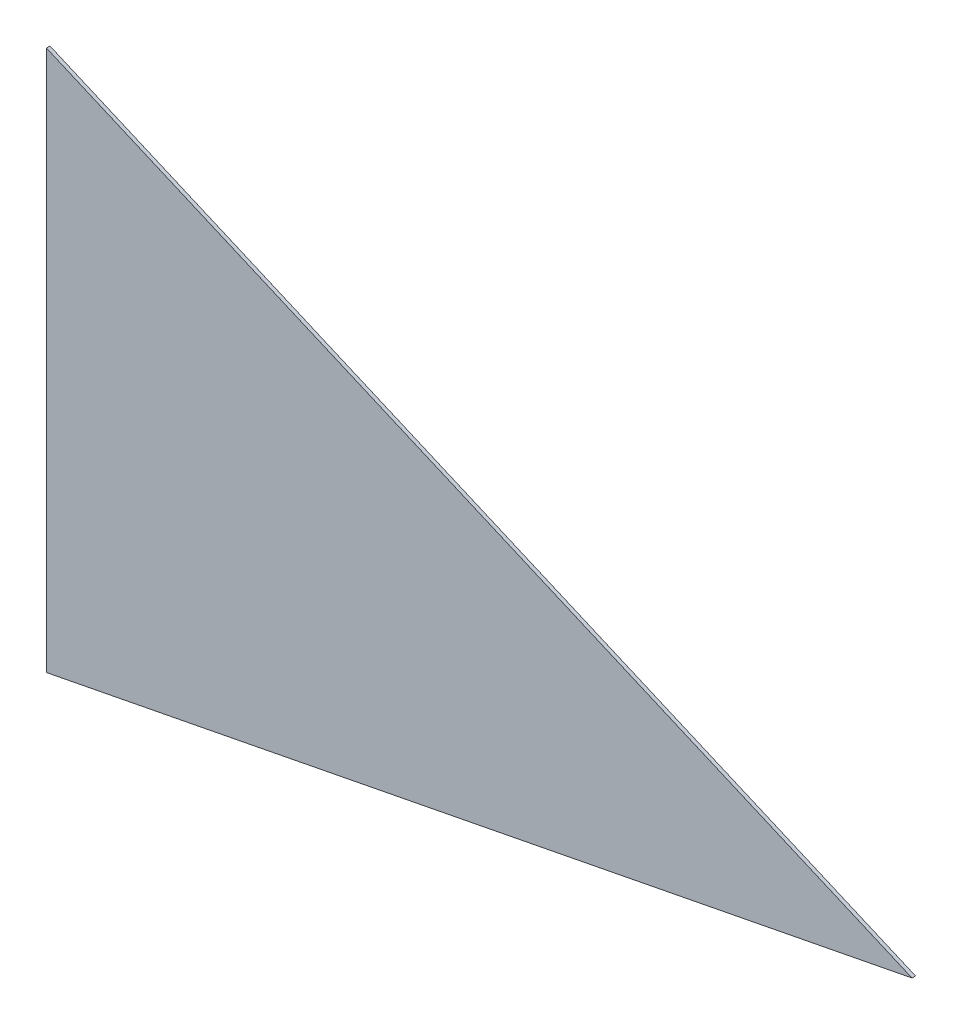
ISO-10303-21;
HEADER;
FILE_DESCRIPTION(('STEP AP214'),'2;1');
FILE_NAME('part.step','',(''),(''),'','','');
FILE_SCHEMA(('AUTOMOTIVE_DESIGN { 1 0 10303 214 1 1 1 1 }'));
ENDSEC;
DATA;
#1=APPLICATION_CONTEXT('core data for automotive mechanical design processes');
#2=APPLICATION_PROTOCOL_DEFINITION('international standard','automotive_design',2000,#1);
#3=PRODUCT_CONTEXT('',#1,'mechanical');
#4=PRODUCT('Part','Part','',(#3));
#5=PRODUCT_RELATED_PRODUCT_CATEGORY('part','',(#4));
#6=PRODUCT_DEFINITION_FORMATION('','',#4);
#7=PRODUCT_DEFINITION_CONTEXT('part definition',#1,'design');
#8=PRODUCT_DEFINITION('design','',#6,#7);
#9=PRODUCT_DEFINITION_SHAPE('','',#8);
#10=(LENGTH_UNIT() NAMED_UNIT(*) SI_UNIT(.MILLI.,.METRE.));
#11=(NAMED_UNIT(*) PLANE_ANGLE_UNIT() SI_UNIT($,.RADIAN.));
#12=(NAMED_UNIT(*) SI_UNIT($,.STERADIAN.) SOLID_ANGLE_UNIT());
#13=UNCERTAINTY_MEASURE_WITH_UNIT(LENGTH_MEASURE(1.E-05),#10,'distance_accuracy_value','');
#14=(GEOMETRIC_REPRESENTATION_CONTEXT(3) GLOBAL_UNCERTAINTY_ASSIGNED_CONTEXT((#13)) GLOBAL_UNIT_ASSIGNED_CONTEXT((#10,
#11,#12)) REPRESENTATION_CONTEXT('',''));
#15=CARTESIAN_POINT('',(0.,0.,0.));
#16=DIRECTION('',(0.,0.,1.));
#17=DIRECTION('',(1.,0.,0.));
#18=AXIS2_PLACEMENT_3D('',#15,#16,#17);
#19=CARTESIAN_POINT('',(0.,0.,3.));
#20=DIRECTION('',(-0.190808995376539,0.981627183447665,0.));
#21=DIRECTION('',(-0.981627183447665,-0.190808995376539,0.));
#22=AXIS2_PLACEMENT_3D('',#19,#20,#21);
#23=PLANE('',#22);
#24=DIRECTION('',(0.981627183447665,0.190808995376539,0.));
#25=VECTOR('',#24,1.);
#26=CARTESIAN_POINT('',(0.,0.,0.));
#27=LINE('',#26,#25);
#28=CARTESIAN_POINT('',(0.,0.,0.));
#29=VERTEX_POINT('',#28);
#30=CARTESIAN_POINT('',(736.220387585749,143.106746532404,0.));
#31=VERTEX_POINT('',#30);
#32=EDGE_CURVE('E80',#29,#31,#27,.T.);
#33=ORIENTED_EDGE('',*,*,#32,.T.);
#34=DIRECTION('',(0.,0.,-1.));
#35=VECTOR('',#34,1.);
#36=CARTESIAN_POINT('',(736.220387585749,143.106746532404,3.));
#37=LINE('',#36,#35);
#38=CARTESIAN_POINT('',(736.220387585749,143.106746532404,3.));
#39=VERTEX_POINT('',#38);
#40=EDGE_CURVE('E11',#39,#31,#37,.T.);
#41=ORIENTED_EDGE('',*,*,#40,.F.);
#42=DIRECTION('',(0.981627183447665,0.190808995376539,0.));
#43=VECTOR('',#42,1.);
#44=CARTESIAN_POINT('',(0.,0.,3.));
#45=LINE('',#44,#43);
#46=CARTESIAN_POINT('',(0.,0.,3.));
#47=VERTEX_POINT('',#46);
#48=EDGE_CURVE('E73',#47,#39,#45,.T.);
#49=ORIENTED_EDGE('',*,*,#48,.F.);
#50=DIRECTION('',(0.,0.,-1.));
#51=VECTOR('',#50,1.);
#52=CARTESIAN_POINT('',(0.,0.,3.));
#53=LINE('',#52,#51);
#54=EDGE_CURVE('E81',#47,#29,#53,.T.);
#55=ORIENTED_EDGE('',*,*,#54,.T.);
#56=EDGE_LOOP('',(#33,#41,#49,#55));
#57=FACE_BOUND('',#56,.T.);
#58=ADVANCED_FACE('F33',(#57),#23,.F.);
#59=CARTESIAN_POINT('',(736.220387585749,143.106746532404,3.));
#60=DIRECTION('',(-0.39536307012628,-0.918524927685864,0.));
#61=DIRECTION('',(0.918524927685864,-0.395363070126281,0.));
#62=AXIS2_PLACEMENT_3D('',#59,#60,#61);
#63=PLANE('',#62);
#64=DIRECTION('',(-0.918524927685864,0.395363070126281,0.));
#65=VECTOR('',#64,1.);
#66=CARTESIAN_POINT('',(736.220387585749,143.106746532404,0.));
#67=LINE('',#66,#65);
#68=CARTESIAN_POINT('',(0.,460.,0.));
#69=VERTEX_POINT('',#68);
#70=EDGE_CURVE('E61',#31,#69,#67,.T.);
#71=ORIENTED_EDGE('',*,*,#70,.T.);
#72=DIRECTION('',(0.,0.,-1.));
#73=VECTOR('',#72,1.);
#74=CARTESIAN_POINT('',(0.,460.,3.));
#75=LINE('',#74,#73);
#76=CARTESIAN_POINT('',(0.,460.,3.));
#77=VERTEX_POINT('',#76);
#78=EDGE_CURVE('E41',#77,#69,#75,.T.);
#79=ORIENTED_EDGE('',*,*,#78,.F.);
#80=DIRECTION('',(-0.918524927685864,0.395363070126281,0.));
#81=VECTOR('',#80,1.);
#82=CARTESIAN_POINT('',(736.220387585749,143.106746532404,3.));
#83=LINE('',#82,#81);
#84=EDGE_CURVE('E69',#39,#77,#83,.T.);
#85=ORIENTED_EDGE('',*,*,#84,.F.);
#86=ORIENTED_EDGE('',*,*,#40,.T.);
#87=EDGE_LOOP('',(#71,#79,#85,#86));
#88=FACE_BOUND('',#87,.T.);
#89=ADVANCED_FACE('F70',(#88),#63,.F.);
#90=CARTESIAN_POINT('',(0.,0.,3.));
#91=DIRECTION('',(1.,0.,0.));
#92=DIRECTION('',(0.,0.,-1.));
#93=AXIS2_PLACEMENT_3D('',#90,#91,#92);
#94=PLANE('',#93);
#95=DIRECTION('',(0.,-1.,0.));
#96=VECTOR('',#95,1.);
#97=CARTESIAN_POINT('',(0.,0.,0.));
#98=LINE('',#97,#96);
#99=EDGE_CURVE('E66',#69,#29,#98,.T.);
#100=ORIENTED_EDGE('',*,*,#99,.T.);
#101=ORIENTED_EDGE('',*,*,#54,.F.);
#102=DIRECTION('',(0.,-1.,0.));
#103=VECTOR('',#102,1.);
#104=CARTESIAN_POINT('',(0.,0.,3.));
#105=LINE('',#104,#103);
#106=EDGE_CURVE('E49',#77,#47,#105,.T.);
#107=ORIENTED_EDGE('',*,*,#106,.F.);
#108=ORIENTED_EDGE('',*,*,#78,.T.);
#109=EDGE_LOOP('',(#100,#101,#107,#108));
#110=FACE_BOUND('',#109,.T.);
#111=ADVANCED_FACE('F88',(#110),#94,.F.);
#112=CARTESIAN_POINT('',(0.,0.,3.));
#113=DIRECTION('',(0.,0.,1.));
#114=DIRECTION('',(1.,0.,0.));
#115=AXIS2_PLACEMENT_3D('',#112,#113,#114);
#116=PLANE('',#115);
#117=ORIENTED_EDGE('',*,*,#48,.T.);
#118=ORIENTED_EDGE('',*,*,#84,.T.);
#119=ORIENTED_EDGE('',*,*,#106,.T.);
#120=EDGE_LOOP('',(#117,#118,#119));
#121=FACE_BOUND('',#120,.T.);
#122=ADVANCED_FACE('F76',(#121),#116,.T.);
#123=CARTESIAN_POINT('',(0.,0.,0.));
#124=DIRECTION('',(0.,0.,1.));
#125=DIRECTION('',(1.,0.,0.));
#126=AXIS2_PLACEMENT_3D('',#123,#124,#125);
#127=PLANE('',#126);
#128=ORIENTED_EDGE('',*,*,#32,.F.);
#129=ORIENTED_EDGE('',*,*,#99,.F.);
#130=ORIENTED_EDGE('',*,*,#70,.F.);
#131=EDGE_LOOP('',(#128,#129,#130));
#132=FACE_BOUND('',#131,.T.);
#133=ADVANCED_FACE('F89',(#132),#127,.F.);
#134=CLOSED_SHELL('',(#58,#89,#111,#122,#133));
#135=MANIFOLD_SOLID_BREP('B2',#134);
#136=ADVANCED_BREP_SHAPE_REPRESENTATION('',(#18,#135),#14);
#137=SHAPE_DEFINITION_REPRESENTATION(#9,#136);
ENDSEC;
END-ISO-10303-21;
